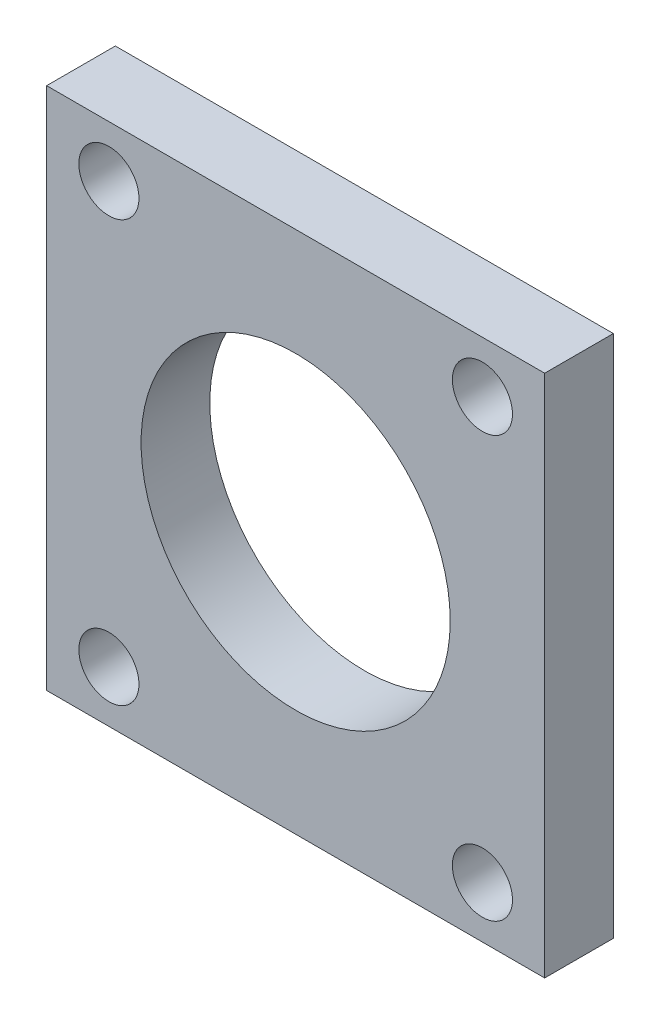
ISO-10303-21;
HEADER;
FILE_DESCRIPTION(('STEP AP214'),'2;1');
FILE_NAME('part.step','',(''),(''),'','','');
FILE_SCHEMA(('AUTOMOTIVE_DESIGN { 1 0 10303 214 1 1 1 1 }'));
ENDSEC;
DATA;
#1=APPLICATION_CONTEXT('core data for automotive mechanical design processes');
#2=APPLICATION_PROTOCOL_DEFINITION('international standard','automotive_design',2000,#1);
#3=PRODUCT_CONTEXT('',#1,'mechanical');
#4=PRODUCT('Part','Part','',(#3));
#5=PRODUCT_RELATED_PRODUCT_CATEGORY('part','',(#4));
#6=PRODUCT_DEFINITION_FORMATION('','',#4);
#7=PRODUCT_DEFINITION_CONTEXT('part definition',#1,'design');
#8=PRODUCT_DEFINITION('design','',#6,#7);
#9=PRODUCT_DEFINITION_SHAPE('','',#8);
#10=(LENGTH_UNIT() NAMED_UNIT(*) SI_UNIT(.MILLI.,.METRE.));
#11=(NAMED_UNIT(*) PLANE_ANGLE_UNIT() SI_UNIT($,.RADIAN.));
#12=(NAMED_UNIT(*) SI_UNIT($,.STERADIAN.) SOLID_ANGLE_UNIT());
#13=UNCERTAINTY_MEASURE_WITH_UNIT(LENGTH_MEASURE(1.E-05),#10,'distance_accuracy_value','');
#14=(GEOMETRIC_REPRESENTATION_CONTEXT(3) GLOBAL_UNCERTAINTY_ASSIGNED_CONTEXT((#13)) GLOBAL_UNIT_ASSIGNED_CONTEXT((#10,
#11,#12)) REPRESENTATION_CONTEXT('',''));
#15=CARTESIAN_POINT('',(0.,0.,0.));
#16=DIRECTION('',(0.,0.,1.));
#17=DIRECTION('',(1.,0.,0.));
#18=AXIS2_PLACEMENT_3D('',#15,#16,#17);
#19=CARTESIAN_POINT('',(0.,-39.9999999999999,8.));
#20=DIRECTION('',(0.,1.,0.));
#21=DIRECTION('',(-1.,0.,0.));
#22=AXIS2_PLACEMENT_3D('',#19,#20,#21);
#23=PLANE('',#22);
#24=DIRECTION('',(1.,0.,0.));
#25=VECTOR('',#24,1.);
#26=CARTESIAN_POINT('',(0.,-39.9999999999999,0.));
#27=LINE('',#26,#25);
#28=CARTESIAN_POINT('',(-404.832040950373,-40.,0.));
#29=VERTEX_POINT('',#28);
#30=CARTESIAN_POINT('',(-346.832040950373,-40.,0.));
#31=VERTEX_POINT('',#30);
#32=EDGE_CURVE('E113',#29,#31,#27,.T.);
#33=ORIENTED_EDGE('',*,*,#32,.T.);
#34=DIRECTION('',(0.,0.,-1.));
#35=VECTOR('',#34,1.);
#36=CARTESIAN_POINT('',(-346.832040950373,-40.,8.));
#37=LINE('',#36,#35);
#38=CARTESIAN_POINT('',(-346.832040950373,-40.,8.));
#39=VERTEX_POINT('',#38);
#40=EDGE_CURVE('E11',#39,#31,#37,.T.);
#41=ORIENTED_EDGE('',*,*,#40,.F.);
#42=DIRECTION('',(1.,0.,0.));
#43=VECTOR('',#42,1.);
#44=CARTESIAN_POINT('',(0.,-39.9999999999999,8.));
#45=LINE('',#44,#43);
#46=CARTESIAN_POINT('',(-404.832040950373,-40.,8.));
#47=VERTEX_POINT('',#46);
#48=EDGE_CURVE('E95',#47,#39,#45,.T.);
#49=ORIENTED_EDGE('',*,*,#48,.F.);
#50=DIRECTION('',(0.,0.,-1.));
#51=VECTOR('',#50,1.);
#52=CARTESIAN_POINT('',(-404.832040950373,-40.,8.));
#53=LINE('',#52,#51);
#54=EDGE_CURVE('E62',#47,#29,#53,.T.);
#55=ORIENTED_EDGE('',*,*,#54,.T.);
#56=EDGE_LOOP('',(#33,#41,#49,#55));
#57=FACE_BOUND('',#56,.T.);
#58=ADVANCED_FACE('F43',(#57),#23,.F.);
#59=CARTESIAN_POINT('',(-346.832040950373,0.,8.));
#60=DIRECTION('',(-1.,0.,0.));
#61=DIRECTION('',(0.,0.,1.));
#62=AXIS2_PLACEMENT_3D('',#59,#60,#61);
#63=PLANE('',#62);
#64=DIRECTION('',(0.,1.,0.));
#65=VECTOR('',#64,1.);
#66=CARTESIAN_POINT('',(-346.832040950373,0.,0.));
#67=LINE('',#66,#65);
#68=CARTESIAN_POINT('',(-346.832040950373,21.,0.));
#69=VERTEX_POINT('',#68);
#70=EDGE_CURVE('E100',#31,#69,#67,.T.);
#71=ORIENTED_EDGE('',*,*,#70,.T.);
#72=DIRECTION('',(0.,0.,-1.));
#73=VECTOR('',#72,1.);
#74=CARTESIAN_POINT('',(-346.832040950373,21.,8.));
#75=LINE('',#74,#73);
#76=CARTESIAN_POINT('',(-346.832040950373,21.,8.));
#77=VERTEX_POINT('',#76);
#78=EDGE_CURVE('E53',#77,#69,#75,.T.);
#79=ORIENTED_EDGE('',*,*,#78,.F.);
#80=DIRECTION('',(0.,1.,0.));
#81=VECTOR('',#80,1.);
#82=CARTESIAN_POINT('',(-346.832040950373,0.,8.));
#83=LINE('',#82,#81);
#84=EDGE_CURVE('E87',#39,#77,#83,.T.);
#85=ORIENTED_EDGE('',*,*,#84,.F.);
#86=ORIENTED_EDGE('',*,*,#40,.T.);
#87=EDGE_LOOP('',(#71,#79,#85,#86));
#88=FACE_BOUND('',#87,.T.);
#89=ADVANCED_FACE('F99',(#88),#63,.F.);
#90=CARTESIAN_POINT('',(0.,21.,8.));
#91=DIRECTION('',(0.,1.,0.));
#92=DIRECTION('',(0.,0.,1.));
#93=AXIS2_PLACEMENT_3D('',#90,#91,#92);
#94=PLANE('',#93);
#95=DIRECTION('',(1.,0.,0.));
#96=VECTOR('',#95,1.);
#97=CARTESIAN_POINT('',(0.,21.,0.));
#98=LINE('',#97,#96);
#99=CARTESIAN_POINT('',(-404.832040950373,21.,0.));
#100=VERTEX_POINT('',#99);
#101=EDGE_CURVE('E117',#100,#69,#98,.T.);
#102=ORIENTED_EDGE('',*,*,#101,.F.);
#103=DIRECTION('',(0.,0.,-1.));
#104=VECTOR('',#103,1.);
#105=CARTESIAN_POINT('',(-404.832040950373,21.,8.));
#106=LINE('',#105,#104);
#107=CARTESIAN_POINT('',(-404.832040950373,21.,8.));
#108=VERTEX_POINT('',#107);
#109=EDGE_CURVE('E76',#108,#100,#106,.T.);
#110=ORIENTED_EDGE('',*,*,#109,.F.);
#111=DIRECTION('',(1.,0.,0.));
#112=VECTOR('',#111,1.);
#113=CARTESIAN_POINT('',(0.,21.,8.));
#114=LINE('',#113,#112);
#115=EDGE_CURVE('E94',#108,#77,#114,.T.);
#116=ORIENTED_EDGE('',*,*,#115,.T.);
#117=ORIENTED_EDGE('',*,*,#78,.T.);
#118=EDGE_LOOP('',(#102,#110,#116,#117));
#119=FACE_BOUND('',#118,.T.);
#120=ADVANCED_FACE('F104',(#119),#94,.T.);
#121=CARTESIAN_POINT('',(-375.832040950373,-9.50000000000002,8.));
#122=DIRECTION('',(0.,0.,-1.));
#123=DIRECTION('',(-1.,0.,0.));
#124=AXIS2_PLACEMENT_3D('',#121,#122,#123);
#125=CYLINDRICAL_SURFACE('',#124,18.);
#126=CARTESIAN_POINT('',(-375.832040950373,-9.50000000000002,8.));
#127=DIRECTION('',(0.,0.,1.));
#128=DIRECTION('',(1.,0.,0.));
#129=AXIS2_PLACEMENT_3D('',#126,#127,#128);
#130=CIRCLE('',#129,18.);
#131=CARTESIAN_POINT('',(-357.832040950373,-9.50000000000002,8.));
#132=VERTEX_POINT('',#131);
#133=EDGE_CURVE('E122',#132,#132,#130,.T.);
#134=ORIENTED_EDGE('',*,*,#133,.T.);
#135=EDGE_LOOP('',(#134));
#136=FACE_BOUND('',#135,.T.);
#137=CARTESIAN_POINT('',(-375.832040950373,-9.50000000000002,0.));
#138=DIRECTION('',(0.,0.,1.));
#139=DIRECTION('',(1.,0.,0.));
#140=AXIS2_PLACEMENT_3D('',#137,#138,#139);
#141=CIRCLE('',#140,18.);
#142=CARTESIAN_POINT('',(-357.832040950373,-9.50000000000002,0.));
#143=VERTEX_POINT('',#142);
#144=EDGE_CURVE('E110',#143,#143,#141,.T.);
#145=ORIENTED_EDGE('',*,*,#144,.F.);
#146=EDGE_LOOP('',(#145));
#147=FACE_BOUND('',#146,.T.);
#148=ADVANCED_FACE('F45',(#136,#147),#125,.F.);
#149=CARTESIAN_POINT('',(-404.832040950373,0.,8.));
#150=DIRECTION('',(-1.,0.,0.));
#151=DIRECTION('',(0.,0.,1.));
#152=AXIS2_PLACEMENT_3D('',#149,#150,#151);
#153=PLANE('',#152);
#154=DIRECTION('',(0.,1.,0.));
#155=VECTOR('',#154,1.);
#156=CARTESIAN_POINT('',(-404.832040950373,0.,0.));
#157=LINE('',#156,#155);
#158=EDGE_CURVE('E119',#29,#100,#157,.T.);
#159=ORIENTED_EDGE('',*,*,#158,.F.);
#160=ORIENTED_EDGE('',*,*,#54,.F.);
#161=DIRECTION('',(0.,1.,0.));
#162=VECTOR('',#161,1.);
#163=CARTESIAN_POINT('',(-404.832040950373,0.,8.));
#164=LINE('',#163,#162);
#165=EDGE_CURVE('E105',#47,#108,#164,.T.);
#166=ORIENTED_EDGE('',*,*,#165,.T.);
#167=ORIENTED_EDGE('',*,*,#109,.T.);
#168=EDGE_LOOP('',(#159,#160,#166,#167));
#169=FACE_BOUND('',#168,.T.);
#170=ADVANCED_FACE('F154',(#169),#153,.T.);
#171=CARTESIAN_POINT('',(0.,0.,8.));
#172=DIRECTION('',(0.,0.,1.));
#173=DIRECTION('',(1.,0.,0.));
#174=AXIS2_PLACEMENT_3D('',#171,#172,#173);
#175=PLANE('',#174);
#176=CARTESIAN_POINT('',(-397.582040950204,14.9999999999894,8.));
#177=DIRECTION('',(0.,0.,1.));
#178=DIRECTION('',(1.,0.,0.));
#179=AXIS2_PLACEMENT_3D('',#176,#177,#178);
#180=CIRCLE('',#179,3.50000000335424);
#181=CARTESIAN_POINT('',(-394.082040946849,14.9999999999894,8.));
#182=VERTEX_POINT('',#181);
#183=EDGE_CURVE('E114',#182,#182,#180,.T.);
#184=ORIENTED_EDGE('',*,*,#183,.F.);
#185=EDGE_LOOP('',(#184));
#186=FACE_BOUND('',#185,.T.);
#187=CARTESIAN_POINT('',(-354.082040950589,14.9999999999894,8.));
#188=DIRECTION('',(0.,0.,1.));
#189=DIRECTION('',(1.,0.,0.));
#190=AXIS2_PLACEMENT_3D('',#187,#188,#189);
#191=CIRCLE('',#190,3.50000000338965);
#192=CARTESIAN_POINT('',(-350.582040947199,14.9999999999894,8.));
#193=VERTEX_POINT('',#192);
#194=EDGE_CURVE('E134',#193,#193,#191,.T.);
#195=ORIENTED_EDGE('',*,*,#194,.F.);
#196=EDGE_LOOP('',(#195));
#197=FACE_BOUND('',#196,.T.);
#198=CARTESIAN_POINT('',(-397.582040950204,-34.0000000000106,8.));
#199=DIRECTION('',(0.,0.,1.));
#200=DIRECTION('',(1.,0.,0.));
#201=AXIS2_PLACEMENT_3D('',#198,#199,#200);
#202=CIRCLE('',#201,3.50000000338965);
#203=CARTESIAN_POINT('',(-394.082040946814,-34.0000000000106,8.));
#204=VERTEX_POINT('',#203);
#205=EDGE_CURVE('E131',#204,#204,#202,.T.);
#206=ORIENTED_EDGE('',*,*,#205,.F.);
#207=EDGE_LOOP('',(#206));
#208=FACE_BOUND('',#207,.T.);
#209=CARTESIAN_POINT('',(-354.082040950543,-34.0000000000106,8.));
#210=DIRECTION('',(0.,0.,1.));
#211=DIRECTION('',(1.,0.,0.));
#212=AXIS2_PLACEMENT_3D('',#209,#210,#211);
#213=CIRCLE('',#212,3.50000000338965);
#214=CARTESIAN_POINT('',(-350.582040947154,-34.0000000000106,8.));
#215=VERTEX_POINT('',#214);
#216=EDGE_CURVE('E128',#215,#215,#213,.T.);
#217=ORIENTED_EDGE('',*,*,#216,.F.);
#218=EDGE_LOOP('',(#217));
#219=FACE_BOUND('',#218,.T.);
#220=ORIENTED_EDGE('',*,*,#133,.F.);
#221=EDGE_LOOP('',(#220));
#222=FACE_BOUND('',#221,.T.);
#223=ORIENTED_EDGE('',*,*,#48,.T.);
#224=ORIENTED_EDGE('',*,*,#84,.T.);
#225=ORIENTED_EDGE('',*,*,#115,.F.);
#226=ORIENTED_EDGE('',*,*,#165,.F.);
#227=EDGE_LOOP('',(#223,#224,#225,#226));
#228=FACE_BOUND('',#227,.T.);
#229=ADVANCED_FACE('F91',(#186,#197,#208,#219,#222,#228),#175,.T.);
#230=CARTESIAN_POINT('',(0.,0.,0.));
#231=DIRECTION('',(0.,0.,1.));
#232=DIRECTION('',(1.,0.,0.));
#233=AXIS2_PLACEMENT_3D('',#230,#231,#232);
#234=PLANE('',#233);
#235=CARTESIAN_POINT('',(-397.582040950204,14.9999999999894,0.));
#236=DIRECTION('',(0.,0.,1.));
#237=DIRECTION('',(1.,0.,0.));
#238=AXIS2_PLACEMENT_3D('',#235,#236,#237);
#239=CIRCLE('',#238,3.50000000335424);
#240=CARTESIAN_POINT('',(-394.082040946849,14.9999999999894,0.));
#241=VERTEX_POINT('',#240);
#242=EDGE_CURVE('E47',#241,#241,#239,.T.);
#243=ORIENTED_EDGE('',*,*,#242,.T.);
#244=EDGE_LOOP('',(#243));
#245=FACE_BOUND('',#244,.T.);
#246=CARTESIAN_POINT('',(-354.082040950589,14.9999999999894,0.));
#247=DIRECTION('',(0.,0.,1.));
#248=DIRECTION('',(1.,0.,0.));
#249=AXIS2_PLACEMENT_3D('',#246,#247,#248);
#250=CIRCLE('',#249,3.50000000338965);
#251=CARTESIAN_POINT('',(-350.582040947199,14.9999999999894,0.));
#252=VERTEX_POINT('',#251);
#253=EDGE_CURVE('E132',#252,#252,#250,.T.);
#254=ORIENTED_EDGE('',*,*,#253,.T.);
#255=EDGE_LOOP('',(#254));
#256=FACE_BOUND('',#255,.T.);
#257=CARTESIAN_POINT('',(-397.582040950204,-34.0000000000106,0.));
#258=DIRECTION('',(0.,0.,1.));
#259=DIRECTION('',(1.,0.,0.));
#260=AXIS2_PLACEMENT_3D('',#257,#258,#259);
#261=CIRCLE('',#260,3.50000000338965);
#262=CARTESIAN_POINT('',(-394.082040946814,-34.0000000000106,0.));
#263=VERTEX_POINT('',#262);
#264=EDGE_CURVE('E129',#263,#263,#261,.T.);
#265=ORIENTED_EDGE('',*,*,#264,.T.);
#266=EDGE_LOOP('',(#265));
#267=FACE_BOUND('',#266,.T.);
#268=CARTESIAN_POINT('',(-354.082040950543,-34.0000000000106,0.));
#269=DIRECTION('',(0.,0.,1.));
#270=DIRECTION('',(1.,0.,0.));
#271=AXIS2_PLACEMENT_3D('',#268,#269,#270);
#272=CIRCLE('',#271,3.50000000338965);
#273=CARTESIAN_POINT('',(-350.582040947154,-34.0000000000106,0.));
#274=VERTEX_POINT('',#273);
#275=EDGE_CURVE('E125',#274,#274,#272,.T.);
#276=ORIENTED_EDGE('',*,*,#275,.T.);
#277=EDGE_LOOP('',(#276));
#278=FACE_BOUND('',#277,.T.);
#279=ORIENTED_EDGE('',*,*,#144,.T.);
#280=EDGE_LOOP('',(#279));
#281=FACE_BOUND('',#280,.T.);
#282=ORIENTED_EDGE('',*,*,#32,.F.);
#283=ORIENTED_EDGE('',*,*,#158,.T.);
#284=ORIENTED_EDGE('',*,*,#101,.T.);
#285=ORIENTED_EDGE('',*,*,#70,.F.);
#286=EDGE_LOOP('',(#282,#283,#284,#285));
#287=FACE_BOUND('',#286,.T.);
#288=ADVANCED_FACE('F153',(#245,#256,#267,#278,#281,#287),#234,.F.);
#289=CARTESIAN_POINT('',(-354.082040950543,-34.0000000000106,-12.));
#290=DIRECTION('',(0.,0.,1.));
#291=DIRECTION('',(1.,0.,0.));
#292=AXIS2_PLACEMENT_3D('',#289,#290,#291);
#293=CYLINDRICAL_SURFACE('',#292,3.50000000338965);
#294=ORIENTED_EDGE('',*,*,#216,.T.);
#295=EDGE_LOOP('',(#294));
#296=FACE_BOUND('',#295,.T.);
#297=ORIENTED_EDGE('',*,*,#275,.F.);
#298=EDGE_LOOP('',(#297));
#299=FACE_BOUND('',#298,.T.);
#300=ADVANCED_FACE('F161',(#296,#299),#293,.F.);
#301=CARTESIAN_POINT('',(-397.582040950204,-34.0000000000106,-12.));
#302=DIRECTION('',(0.,0.,1.));
#303=DIRECTION('',(1.,0.,0.));
#304=AXIS2_PLACEMENT_3D('',#301,#302,#303);
#305=CYLINDRICAL_SURFACE('',#304,3.50000000338965);
#306=ORIENTED_EDGE('',*,*,#205,.T.);
#307=EDGE_LOOP('',(#306));
#308=FACE_BOUND('',#307,.T.);
#309=ORIENTED_EDGE('',*,*,#264,.F.);
#310=EDGE_LOOP('',(#309));
#311=FACE_BOUND('',#310,.T.);
#312=ADVANCED_FACE('F198',(#308,#311),#305,.F.);
#313=CARTESIAN_POINT('',(-354.082040950589,14.9999999999894,-12.));
#314=DIRECTION('',(0.,0.,1.));
#315=DIRECTION('',(1.,0.,0.));
#316=AXIS2_PLACEMENT_3D('',#313,#314,#315);
#317=CYLINDRICAL_SURFACE('',#316,3.50000000338965);
#318=ORIENTED_EDGE('',*,*,#194,.T.);
#319=EDGE_LOOP('',(#318));
#320=FACE_BOUND('',#319,.T.);
#321=ORIENTED_EDGE('',*,*,#253,.F.);
#322=EDGE_LOOP('',(#321));
#323=FACE_BOUND('',#322,.T.);
#324=ADVANCED_FACE('F208',(#320,#323),#317,.F.);
#325=CARTESIAN_POINT('',(-397.582040950204,14.9999999999894,-12.));
#326=DIRECTION('',(0.,0.,1.));
#327=DIRECTION('',(1.,0.,0.));
#328=AXIS2_PLACEMENT_3D('',#325,#326,#327);
#329=CYLINDRICAL_SURFACE('',#328,3.50000000335424);
#330=ORIENTED_EDGE('',*,*,#183,.T.);
#331=EDGE_LOOP('',(#330));
#332=FACE_BOUND('',#331,.T.);
#333=ORIENTED_EDGE('',*,*,#242,.F.);
#334=EDGE_LOOP('',(#333));
#335=FACE_BOUND('',#334,.T.);
#336=ADVANCED_FACE('F217',(#332,#335),#329,.F.);
#337=CLOSED_SHELL('',(#58,#89,#120,#148,#170,#229,#288,#300,#312,#324,#336));
#338=MANIFOLD_SOLID_BREP('B2',#337);
#339=ADVANCED_BREP_SHAPE_REPRESENTATION('',(#18,#338),#14);
#340=SHAPE_DEFINITION_REPRESENTATION(#9,#339);
ENDSEC;
END-ISO-10303-21;
